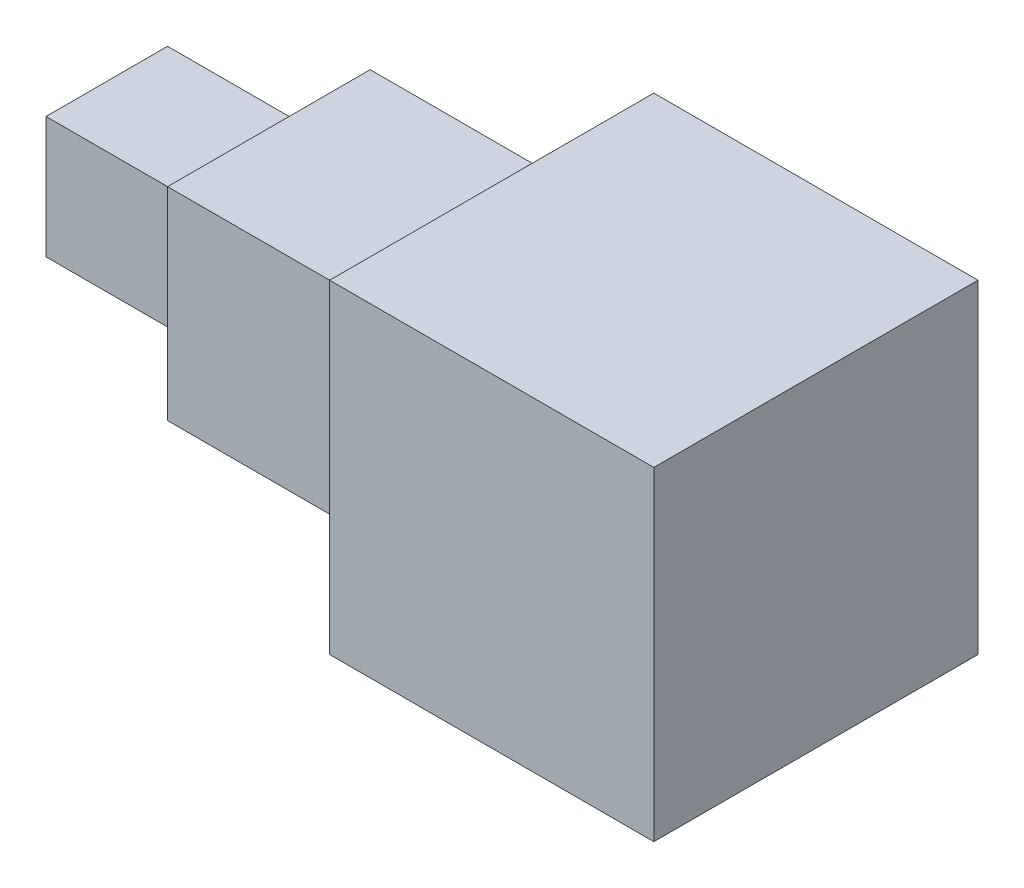
ISO-10303-21;
HEADER;
FILE_DESCRIPTION(('STEP AP214'),'2;1');
FILE_NAME('part.step','',(''),(''),'','','');
FILE_SCHEMA(('AUTOMOTIVE_DESIGN { 1 0 10303 214 1 1 1 1 }'));
ENDSEC;
DATA;
#1=APPLICATION_CONTEXT('core data for automotive mechanical design processes');
#2=APPLICATION_PROTOCOL_DEFINITION('international standard','automotive_design',2000,#1);
#3=PRODUCT_CONTEXT('',#1,'mechanical');
#4=PRODUCT('Part','Part','',(#3));
#5=PRODUCT_RELATED_PRODUCT_CATEGORY('part','',(#4));
#6=PRODUCT_DEFINITION_FORMATION('','',#4);
#7=PRODUCT_DEFINITION_CONTEXT('part definition',#1,'design');
#8=PRODUCT_DEFINITION('design','',#6,#7);
#9=PRODUCT_DEFINITION_SHAPE('','',#8);
#10=(LENGTH_UNIT() NAMED_UNIT(*) SI_UNIT(.MILLI.,.METRE.));
#11=(NAMED_UNIT(*) PLANE_ANGLE_UNIT() SI_UNIT($,.RADIAN.));
#12=(NAMED_UNIT(*) SI_UNIT($,.STERADIAN.) SOLID_ANGLE_UNIT());
#13=UNCERTAINTY_MEASURE_WITH_UNIT(LENGTH_MEASURE(1.E-05),#10,'distance_accuracy_value','');
#14=(GEOMETRIC_REPRESENTATION_CONTEXT(3) GLOBAL_UNCERTAINTY_ASSIGNED_CONTEXT((#13)) GLOBAL_UNIT_ASSIGNED_CONTEXT((#10,
#11,#12)) REPRESENTATION_CONTEXT('',''));
#15=CARTESIAN_POINT('',(0.,0.,0.));
#16=DIRECTION('',(0.,0.,1.));
#17=DIRECTION('',(1.,0.,0.));
#18=AXIS2_PLACEMENT_3D('',#15,#16,#17);
#19=CARTESIAN_POINT('',(508.,203.2,0.));
#20=DIRECTION('',(0.,1.,0.));
#21=DIRECTION('',(-1.,0.,0.));
#22=AXIS2_PLACEMENT_3D('',#19,#20,#21);
#23=PLANE('',#22);
#24=DIRECTION('',(1.,0.,0.));
#25=VECTOR('',#24,1.);
#26=CARTESIAN_POINT('',(406.4,203.2,0.));
#27=LINE('',#26,#25);
#28=CARTESIAN_POINT('',(304.8,203.2,0.));
#29=VERTEX_POINT('',#28);
#30=CARTESIAN_POINT('',(508.,203.2,0.));
#31=VERTEX_POINT('',#30);
#32=EDGE_CURVE('P0_E58',#29,#31,#27,.T.);
#33=ORIENTED_EDGE('',*,*,#32,.F.);
#34=DIRECTION('',(0.,0.,-1.));
#35=VECTOR('',#34,1.);
#36=CARTESIAN_POINT('',(304.8,203.2,101.6));
#37=LINE('',#36,#35);
#38=CARTESIAN_POINT('',(304.8,203.2,203.2));
#39=VERTEX_POINT('',#38);
#40=EDGE_CURVE('P0_E20',#39,#29,#37,.T.);
#41=ORIENTED_EDGE('',*,*,#40,.F.);
#42=DIRECTION('',(-1.,0.,0.));
#43=VECTOR('',#42,1.);
#44=CARTESIAN_POINT('',(406.4,203.2,203.2));
#45=LINE('',#44,#43);
#46=CARTESIAN_POINT('',(508.,203.2,203.2));
#47=VERTEX_POINT('',#46);
#48=EDGE_CURVE('P0_E54',#47,#39,#45,.T.);
#49=ORIENTED_EDGE('',*,*,#48,.F.);
#50=DIRECTION('',(0.,0.,1.));
#51=VECTOR('',#50,1.);
#52=CARTESIAN_POINT('',(508.,203.2,101.6));
#53=LINE('',#52,#51);
#54=EDGE_CURVE('P0_E69',#31,#47,#53,.T.);
#55=ORIENTED_EDGE('',*,*,#54,.F.);
#56=EDGE_LOOP('',(#33,#41,#49,#55));
#57=FACE_BOUND('',#56,.T.);
#58=ADVANCED_FACE('P0_F16',(#57),#23,.T.);
#59=CARTESIAN_POINT('',(304.8,203.2,0.));
#60=DIRECTION('',(-1.,0.,0.));
#61=DIRECTION('',(0.,-1.,0.));
#62=AXIS2_PLACEMENT_3D('',#59,#60,#61);
#63=PLANE('',#62);
#64=DIRECTION('',(0.,1.,0.));
#65=VECTOR('',#64,1.);
#66=CARTESIAN_POINT('',(304.8,101.6,0.));
#67=LINE('',#66,#65);
#68=CARTESIAN_POINT('',(304.8,0.,0.));
#69=VERTEX_POINT('',#68);
#70=EDGE_CURVE('P0_E77',#69,#29,#67,.T.);
#71=ORIENTED_EDGE('',*,*,#70,.F.);
#72=DIRECTION('',(0.,0.,-1.));
#73=VECTOR('',#72,1.);
#74=CARTESIAN_POINT('',(304.8,0.,101.6));
#75=LINE('',#74,#73);
#76=CARTESIAN_POINT('',(304.8,0.,203.2));
#77=VERTEX_POINT('',#76);
#78=EDGE_CURVE('P0_E35',#77,#69,#75,.T.);
#79=ORIENTED_EDGE('',*,*,#78,.F.);
#80=DIRECTION('',(0.,-1.,0.));
#81=VECTOR('',#80,1.);
#82=CARTESIAN_POINT('',(304.8,101.6,203.2));
#83=LINE('',#82,#81);
#84=EDGE_CURVE('P0_E60',#39,#77,#83,.T.);
#85=ORIENTED_EDGE('',*,*,#84,.F.);
#86=ORIENTED_EDGE('',*,*,#40,.T.);
#87=EDGE_LOOP('',(#71,#79,#85,#86));
#88=FACE_BOUND('',#87,.T.);
#89=ADVANCED_FACE('P0_F61',(#88),#63,.T.);
#90=CARTESIAN_POINT('',(304.8,0.,203.2));
#91=DIRECTION('',(0.,0.,1.));
#92=DIRECTION('',(1.,0.,0.));
#93=AXIS2_PLACEMENT_3D('',#90,#91,#92);
#94=PLANE('',#93);
#95=DIRECTION('',(-1.,0.,0.));
#96=VECTOR('',#95,1.);
#97=CARTESIAN_POINT('',(406.4,0.,203.2));
#98=LINE('',#97,#96);
#99=CARTESIAN_POINT('',(508.,0.,203.2));
#100=VERTEX_POINT('',#99);
#101=EDGE_CURVE('P0_E80',#100,#77,#98,.T.);
#102=ORIENTED_EDGE('',*,*,#101,.F.);
#103=DIRECTION('',(0.,-1.,0.));
#104=VECTOR('',#103,1.);
#105=CARTESIAN_POINT('',(508.,101.6,203.2));
#106=LINE('',#105,#104);
#107=EDGE_CURVE('P0_E66',#47,#100,#106,.T.);
#108=ORIENTED_EDGE('',*,*,#107,.F.);
#109=ORIENTED_EDGE('',*,*,#48,.T.);
#110=ORIENTED_EDGE('',*,*,#84,.T.);
#111=EDGE_LOOP('',(#102,#108,#109,#110));
#112=FACE_BOUND('',#111,.T.);
#113=ADVANCED_FACE('P0_F64',(#112),#94,.T.);
#114=CARTESIAN_POINT('',(508.,0.,0.));
#115=DIRECTION('',(1.,0.,0.));
#116=DIRECTION('',(0.,1.,0.));
#117=AXIS2_PLACEMENT_3D('',#114,#115,#116);
#118=PLANE('',#117);
#119=DIRECTION('',(0.,-1.,0.));
#120=VECTOR('',#119,1.);
#121=CARTESIAN_POINT('',(508.,101.6,0.));
#122=LINE('',#121,#120);
#123=CARTESIAN_POINT('',(508.,0.,0.));
#124=VERTEX_POINT('',#123);
#125=EDGE_CURVE('P0_E73',#31,#124,#122,.T.);
#126=ORIENTED_EDGE('',*,*,#125,.F.);
#127=ORIENTED_EDGE('',*,*,#54,.T.);
#128=ORIENTED_EDGE('',*,*,#107,.T.);
#129=DIRECTION('',(0.,0.,1.));
#130=VECTOR('',#129,1.);
#131=CARTESIAN_POINT('',(508.,0.,101.6));
#132=LINE('',#131,#130);
#133=EDGE_CURVE('P0_E26',#124,#100,#132,.T.);
#134=ORIENTED_EDGE('',*,*,#133,.F.);
#135=EDGE_LOOP('',(#126,#127,#128,#134));
#136=FACE_BOUND('',#135,.T.);
#137=ADVANCED_FACE('P0_F88',(#136),#118,.T.);
#138=CARTESIAN_POINT('',(304.8,0.,0.));
#139=DIRECTION('',(0.,0.,-1.));
#140=DIRECTION('',(0.,1.,0.));
#141=AXIS2_PLACEMENT_3D('',#138,#139,#140);
#142=PLANE('',#141);
#143=ORIENTED_EDGE('',*,*,#70,.T.);
#144=ORIENTED_EDGE('',*,*,#32,.T.);
#145=ORIENTED_EDGE('',*,*,#125,.T.);
#146=DIRECTION('',(1.,0.,0.));
#147=VECTOR('',#146,1.);
#148=CARTESIAN_POINT('',(406.4,0.,0.));
#149=LINE('',#148,#147);
#150=EDGE_CURVE('P0_E11',#69,#124,#149,.T.);
#151=ORIENTED_EDGE('',*,*,#150,.F.);
#152=EDGE_LOOP('',(#143,#144,#145,#151));
#153=FACE_BOUND('',#152,.T.);
#154=ADVANCED_FACE('P0_F90',(#153),#142,.T.);
#155=CARTESIAN_POINT('',(304.8,0.,0.));
#156=DIRECTION('',(0.,-1.,0.));
#157=DIRECTION('',(1.,0.,0.));
#158=AXIS2_PLACEMENT_3D('',#155,#156,#157);
#159=PLANE('',#158);
#160=ORIENTED_EDGE('',*,*,#150,.T.);
#161=ORIENTED_EDGE('',*,*,#133,.T.);
#162=ORIENTED_EDGE('',*,*,#101,.T.);
#163=ORIENTED_EDGE('',*,*,#78,.T.);
#164=EDGE_LOOP('',(#160,#161,#162,#163));
#165=FACE_BOUND('',#164,.T.);
#166=ADVANCED_FACE('P0_F18',(#165),#159,.T.);
#167=CLOSED_SHELL('',(#58,#89,#113,#137,#154,#166));
#168=MANIFOLD_SOLID_BREP('P0_B1',#167);
#169=CARTESIAN_POINT('',(254.,127.,0.));
#170=DIRECTION('',(0.,1.,0.));
#171=DIRECTION('',(-1.,0.,0.));
#172=AXIS2_PLACEMENT_3D('',#169,#170,#171);
#173=PLANE('',#172);
#174=DIRECTION('',(1.,0.,0.));
#175=VECTOR('',#174,1.);
#176=CARTESIAN_POINT('',(190.5,127.,0.));
#177=LINE('',#176,#175);
#178=CARTESIAN_POINT('',(127.,127.,0.));
#179=VERTEX_POINT('',#178);
#180=CARTESIAN_POINT('',(254.,127.,0.));
#181=VERTEX_POINT('',#180);
#182=EDGE_CURVE('P1_E59',#179,#181,#177,.T.);
#183=ORIENTED_EDGE('',*,*,#182,.F.);
#184=DIRECTION('',(0.,0.,-1.));
#185=VECTOR('',#184,1.);
#186=CARTESIAN_POINT('',(127.,127.,63.5));
#187=LINE('',#186,#185);
#188=CARTESIAN_POINT('',(127.,127.,127.));
#189=VERTEX_POINT('',#188);
#190=EDGE_CURVE('P1_E21',#189,#179,#187,.T.);
#191=ORIENTED_EDGE('',*,*,#190,.F.);
#192=DIRECTION('',(-1.,0.,0.));
#193=VECTOR('',#192,1.);
#194=CARTESIAN_POINT('',(190.5,127.,127.));
#195=LINE('',#194,#193);
#196=CARTESIAN_POINT('',(254.,127.,127.));
#197=VERTEX_POINT('',#196);
#198=EDGE_CURVE('P1_E55',#197,#189,#195,.T.);
#199=ORIENTED_EDGE('',*,*,#198,.F.);
#200=DIRECTION('',(0.,0.,1.));
#201=VECTOR('',#200,1.);
#202=CARTESIAN_POINT('',(254.,127.,63.5));
#203=LINE('',#202,#201);
#204=EDGE_CURVE('P1_E70',#181,#197,#203,.T.);
#205=ORIENTED_EDGE('',*,*,#204,.F.);
#206=EDGE_LOOP('',(#183,#191,#199,#205));
#207=FACE_BOUND('',#206,.T.);
#208=ADVANCED_FACE('P1_F17',(#207),#173,.T.);
#209=CARTESIAN_POINT('',(127.,127.,0.));
#210=DIRECTION('',(-1.,0.,0.));
#211=DIRECTION('',(0.,-1.,0.));
#212=AXIS2_PLACEMENT_3D('',#209,#210,#211);
#213=PLANE('',#212);
#214=DIRECTION('',(0.,1.,0.));
#215=VECTOR('',#214,1.);
#216=CARTESIAN_POINT('',(127.,63.5,0.));
#217=LINE('',#216,#215);
#218=CARTESIAN_POINT('',(127.,0.,0.));
#219=VERTEX_POINT('',#218);
#220=EDGE_CURVE('P1_E78',#219,#179,#217,.T.);
#221=ORIENTED_EDGE('',*,*,#220,.F.);
#222=DIRECTION('',(0.,0.,-1.));
#223=VECTOR('',#222,1.);
#224=CARTESIAN_POINT('',(127.,0.,63.5));
#225=LINE('',#224,#223);
#226=CARTESIAN_POINT('',(127.,0.,127.));
#227=VERTEX_POINT('',#226);
#228=EDGE_CURVE('P1_E36',#227,#219,#225,.T.);
#229=ORIENTED_EDGE('',*,*,#228,.F.);
#230=DIRECTION('',(0.,-1.,0.));
#231=VECTOR('',#230,1.);
#232=CARTESIAN_POINT('',(127.,63.5,127.));
#233=LINE('',#232,#231);
#234=EDGE_CURVE('P1_E61',#189,#227,#233,.T.);
#235=ORIENTED_EDGE('',*,*,#234,.F.);
#236=ORIENTED_EDGE('',*,*,#190,.T.);
#237=EDGE_LOOP('',(#221,#229,#235,#236));
#238=FACE_BOUND('',#237,.T.);
#239=ADVANCED_FACE('P1_F62',(#238),#213,.T.);
#240=CARTESIAN_POINT('',(127.,0.,127.));
#241=DIRECTION('',(0.,0.,1.));
#242=DIRECTION('',(1.,0.,0.));
#243=AXIS2_PLACEMENT_3D('',#240,#241,#242);
#244=PLANE('',#243);
#245=DIRECTION('',(-1.,0.,0.));
#246=VECTOR('',#245,1.);
#247=CARTESIAN_POINT('',(190.5,0.,127.));
#248=LINE('',#247,#246);
#249=CARTESIAN_POINT('',(254.,0.,127.));
#250=VERTEX_POINT('',#249);
#251=EDGE_CURVE('P1_E81',#250,#227,#248,.T.);
#252=ORIENTED_EDGE('',*,*,#251,.F.);
#253=DIRECTION('',(0.,-1.,0.));
#254=VECTOR('',#253,1.);
#255=CARTESIAN_POINT('',(254.,63.5,127.));
#256=LINE('',#255,#254);
#257=EDGE_CURVE('P1_E67',#197,#250,#256,.T.);
#258=ORIENTED_EDGE('',*,*,#257,.F.);
#259=ORIENTED_EDGE('',*,*,#198,.T.);
#260=ORIENTED_EDGE('',*,*,#234,.T.);
#261=EDGE_LOOP('',(#252,#258,#259,#260));
#262=FACE_BOUND('',#261,.T.);
#263=ADVANCED_FACE('P1_F65',(#262),#244,.T.);
#264=CARTESIAN_POINT('',(254.,0.,0.));
#265=DIRECTION('',(1.,0.,0.));
#266=DIRECTION('',(0.,1.,0.));
#267=AXIS2_PLACEMENT_3D('',#264,#265,#266);
#268=PLANE('',#267);
#269=DIRECTION('',(0.,-1.,0.));
#270=VECTOR('',#269,1.);
#271=CARTESIAN_POINT('',(254.,63.5,0.));
#272=LINE('',#271,#270);
#273=CARTESIAN_POINT('',(254.,0.,0.));
#274=VERTEX_POINT('',#273);
#275=EDGE_CURVE('P1_E74',#181,#274,#272,.T.);
#276=ORIENTED_EDGE('',*,*,#275,.F.);
#277=ORIENTED_EDGE('',*,*,#204,.T.);
#278=ORIENTED_EDGE('',*,*,#257,.T.);
#279=DIRECTION('',(0.,0.,1.));
#280=VECTOR('',#279,1.);
#281=CARTESIAN_POINT('',(254.,0.,63.5));
#282=LINE('',#281,#280);
#283=EDGE_CURVE('P1_E27',#274,#250,#282,.T.);
#284=ORIENTED_EDGE('',*,*,#283,.F.);
#285=EDGE_LOOP('',(#276,#277,#278,#284));
#286=FACE_BOUND('',#285,.T.);
#287=ADVANCED_FACE('P1_F89',(#286),#268,.T.);
#288=CARTESIAN_POINT('',(127.,0.,0.));
#289=DIRECTION('',(0.,0.,-1.));
#290=DIRECTION('',(0.,1.,0.));
#291=AXIS2_PLACEMENT_3D('',#288,#289,#290);
#292=PLANE('',#291);
#293=ORIENTED_EDGE('',*,*,#220,.T.);
#294=ORIENTED_EDGE('',*,*,#182,.T.);
#295=ORIENTED_EDGE('',*,*,#275,.T.);
#296=DIRECTION('',(1.,0.,0.));
#297=VECTOR('',#296,1.);
#298=CARTESIAN_POINT('',(190.5,0.,0.));
#299=LINE('',#298,#297);
#300=EDGE_CURVE('P1_E11',#219,#274,#299,.T.);
#301=ORIENTED_EDGE('',*,*,#300,.F.);
#302=EDGE_LOOP('',(#293,#294,#295,#301));
#303=FACE_BOUND('',#302,.T.);
#304=ADVANCED_FACE('P1_F91',(#303),#292,.T.);
#305=CARTESIAN_POINT('',(127.,0.,0.));
#306=DIRECTION('',(0.,-1.,0.));
#307=DIRECTION('',(1.,0.,0.));
#308=AXIS2_PLACEMENT_3D('',#305,#306,#307);
#309=PLANE('',#308);
#310=ORIENTED_EDGE('',*,*,#300,.T.);
#311=ORIENTED_EDGE('',*,*,#283,.T.);
#312=ORIENTED_EDGE('',*,*,#251,.T.);
#313=ORIENTED_EDGE('',*,*,#228,.T.);
#314=EDGE_LOOP('',(#310,#311,#312,#313));
#315=FACE_BOUND('',#314,.T.);
#316=ADVANCED_FACE('P1_F19',(#315),#309,.T.);
#317=CLOSED_SHELL('',(#208,#239,#263,#287,#304,#316));
#318=MANIFOLD_SOLID_BREP('P1_B1',#317);
#319=CARTESIAN_POINT('',(76.2,76.2,0.));
#320=DIRECTION('',(0.,1.,0.));
#321=DIRECTION('',(-1.,0.,0.));
#322=AXIS2_PLACEMENT_3D('',#319,#320,#321);
#323=PLANE('',#322);
#324=DIRECTION('',(1.,0.,0.));
#325=VECTOR('',#324,1.);
#326=CARTESIAN_POINT('',(38.1,76.2,0.));
#327=LINE('',#326,#325);
#328=CARTESIAN_POINT('',(0.,76.2,0.));
#329=VERTEX_POINT('',#328);
#330=CARTESIAN_POINT('',(76.2,76.2,0.));
#331=VERTEX_POINT('',#330);
#332=EDGE_CURVE('P2_E59',#329,#331,#327,.T.);
#333=ORIENTED_EDGE('',*,*,#332,.F.);
#334=DIRECTION('',(0.,0.,-1.));
#335=VECTOR('',#334,1.);
#336=CARTESIAN_POINT('',(0.,76.2,38.1));
#337=LINE('',#336,#335);
#338=CARTESIAN_POINT('',(0.,76.2,76.2));
#339=VERTEX_POINT('',#338);
#340=EDGE_CURVE('P2_E21',#339,#329,#337,.T.);
#341=ORIENTED_EDGE('',*,*,#340,.F.);
#342=DIRECTION('',(-1.,0.,0.));
#343=VECTOR('',#342,1.);
#344=CARTESIAN_POINT('',(38.1,76.2,76.2));
#345=LINE('',#344,#343);
#346=CARTESIAN_POINT('',(76.2,76.2,76.2));
#347=VERTEX_POINT('',#346);
#348=EDGE_CURVE('P2_E55',#347,#339,#345,.T.);
#349=ORIENTED_EDGE('',*,*,#348,.F.);
#350=DIRECTION('',(0.,0.,1.));
#351=VECTOR('',#350,1.);
#352=CARTESIAN_POINT('',(76.2,76.2,38.1));
#353=LINE('',#352,#351);
#354=EDGE_CURVE('P2_E70',#331,#347,#353,.T.);
#355=ORIENTED_EDGE('',*,*,#354,.F.);
#356=EDGE_LOOP('',(#333,#341,#349,#355));
#357=FACE_BOUND('',#356,.T.);
#358=ADVANCED_FACE('P2_F17',(#357),#323,.T.);
#359=CARTESIAN_POINT('',(0.,76.2,0.));
#360=DIRECTION('',(-1.,0.,0.));
#361=DIRECTION('',(0.,-1.,0.));
#362=AXIS2_PLACEMENT_3D('',#359,#360,#361);
#363=PLANE('',#362);
#364=DIRECTION('',(0.,1.,0.));
#365=VECTOR('',#364,1.);
#366=CARTESIAN_POINT('',(0.,38.1,0.));
#367=LINE('',#366,#365);
#368=CARTESIAN_POINT('',(0.,0.,0.));
#369=VERTEX_POINT('',#368);
#370=EDGE_CURVE('P2_E78',#369,#329,#367,.T.);
#371=ORIENTED_EDGE('',*,*,#370,.F.);
#372=DIRECTION('',(0.,0.,-1.));
#373=VECTOR('',#372,1.);
#374=CARTESIAN_POINT('',(0.,0.,38.1));
#375=LINE('',#374,#373);
#376=CARTESIAN_POINT('',(0.,0.,76.2));
#377=VERTEX_POINT('',#376);
#378=EDGE_CURVE('P2_E36',#377,#369,#375,.T.);
#379=ORIENTED_EDGE('',*,*,#378,.F.);
#380=DIRECTION('',(0.,-1.,0.));
#381=VECTOR('',#380,1.);
#382=CARTESIAN_POINT('',(0.,38.1,76.2));
#383=LINE('',#382,#381);
#384=EDGE_CURVE('P2_E61',#339,#377,#383,.T.);
#385=ORIENTED_EDGE('',*,*,#384,.F.);
#386=ORIENTED_EDGE('',*,*,#340,.T.);
#387=EDGE_LOOP('',(#371,#379,#385,#386));
#388=FACE_BOUND('',#387,.T.);
#389=ADVANCED_FACE('P2_F62',(#388),#363,.T.);
#390=CARTESIAN_POINT('',(0.,0.,76.2));
#391=DIRECTION('',(0.,0.,1.));
#392=DIRECTION('',(1.,0.,0.));
#393=AXIS2_PLACEMENT_3D('',#390,#391,#392);
#394=PLANE('',#393);
#395=DIRECTION('',(-1.,0.,0.));
#396=VECTOR('',#395,1.);
#397=CARTESIAN_POINT('',(38.1,0.,76.2));
#398=LINE('',#397,#396);
#399=CARTESIAN_POINT('',(76.2,0.,76.2));
#400=VERTEX_POINT('',#399);
#401=EDGE_CURVE('P2_E81',#400,#377,#398,.T.);
#402=ORIENTED_EDGE('',*,*,#401,.F.);
#403=DIRECTION('',(0.,-1.,0.));
#404=VECTOR('',#403,1.);
#405=CARTESIAN_POINT('',(76.2,38.1,76.2));
#406=LINE('',#405,#404);
#407=EDGE_CURVE('P2_E67',#347,#400,#406,.T.);
#408=ORIENTED_EDGE('',*,*,#407,.F.);
#409=ORIENTED_EDGE('',*,*,#348,.T.);
#410=ORIENTED_EDGE('',*,*,#384,.T.);
#411=EDGE_LOOP('',(#402,#408,#409,#410));
#412=FACE_BOUND('',#411,.T.);
#413=ADVANCED_FACE('P2_F65',(#412),#394,.T.);
#414=CARTESIAN_POINT('',(76.2,0.,0.));
#415=DIRECTION('',(1.,0.,0.));
#416=DIRECTION('',(0.,1.,0.));
#417=AXIS2_PLACEMENT_3D('',#414,#415,#416);
#418=PLANE('',#417);
#419=DIRECTION('',(0.,-1.,0.));
#420=VECTOR('',#419,1.);
#421=CARTESIAN_POINT('',(76.2,38.1,0.));
#422=LINE('',#421,#420);
#423=CARTESIAN_POINT('',(76.2,0.,0.));
#424=VERTEX_POINT('',#423);
#425=EDGE_CURVE('P2_E74',#331,#424,#422,.T.);
#426=ORIENTED_EDGE('',*,*,#425,.F.);
#427=ORIENTED_EDGE('',*,*,#354,.T.);
#428=ORIENTED_EDGE('',*,*,#407,.T.);
#429=DIRECTION('',(0.,0.,1.));
#430=VECTOR('',#429,1.);
#431=CARTESIAN_POINT('',(76.2,0.,38.1));
#432=LINE('',#431,#430);
#433=EDGE_CURVE('P2_E27',#424,#400,#432,.T.);
#434=ORIENTED_EDGE('',*,*,#433,.F.);
#435=EDGE_LOOP('',(#426,#427,#428,#434));
#436=FACE_BOUND('',#435,.T.);
#437=ADVANCED_FACE('P2_F89',(#436),#418,.T.);
#438=CARTESIAN_POINT('',(0.,0.,0.));
#439=DIRECTION('',(0.,0.,-1.));
#440=DIRECTION('',(0.,1.,0.));
#441=AXIS2_PLACEMENT_3D('',#438,#439,#440);
#442=PLANE('',#441);
#443=ORIENTED_EDGE('',*,*,#370,.T.);
#444=ORIENTED_EDGE('',*,*,#332,.T.);
#445=ORIENTED_EDGE('',*,*,#425,.T.);
#446=DIRECTION('',(1.,0.,0.));
#447=VECTOR('',#446,1.);
#448=CARTESIAN_POINT('',(38.1,0.,0.));
#449=LINE('',#448,#447);
#450=EDGE_CURVE('P2_E11',#369,#424,#449,.T.);
#451=ORIENTED_EDGE('',*,*,#450,.F.);
#452=EDGE_LOOP('',(#443,#444,#445,#451));
#453=FACE_BOUND('',#452,.T.);
#454=ADVANCED_FACE('P2_F91',(#453),#442,.T.);
#455=CARTESIAN_POINT('',(0.,0.,0.));
#456=DIRECTION('',(0.,-1.,0.));
#457=DIRECTION('',(1.,0.,0.));
#458=AXIS2_PLACEMENT_3D('',#455,#456,#457);
#459=PLANE('',#458);
#460=ORIENTED_EDGE('',*,*,#450,.T.);
#461=ORIENTED_EDGE('',*,*,#433,.T.);
#462=ORIENTED_EDGE('',*,*,#401,.T.);
#463=ORIENTED_EDGE('',*,*,#378,.T.);
#464=EDGE_LOOP('',(#460,#461,#462,#463));
#465=FACE_BOUND('',#464,.T.);
#466=ADVANCED_FACE('P2_F19',(#465),#459,.T.);
#467=CLOSED_SHELL('',(#358,#389,#413,#437,#454,#466));
#468=MANIFOLD_SOLID_BREP('P2_B1',#467);
#469=ADVANCED_BREP_SHAPE_REPRESENTATION('',(#18,#168,#318,#468),#14);
#470=SHAPE_DEFINITION_REPRESENTATION(#9,#469);
ENDSEC;
END-ISO-10303-21;
